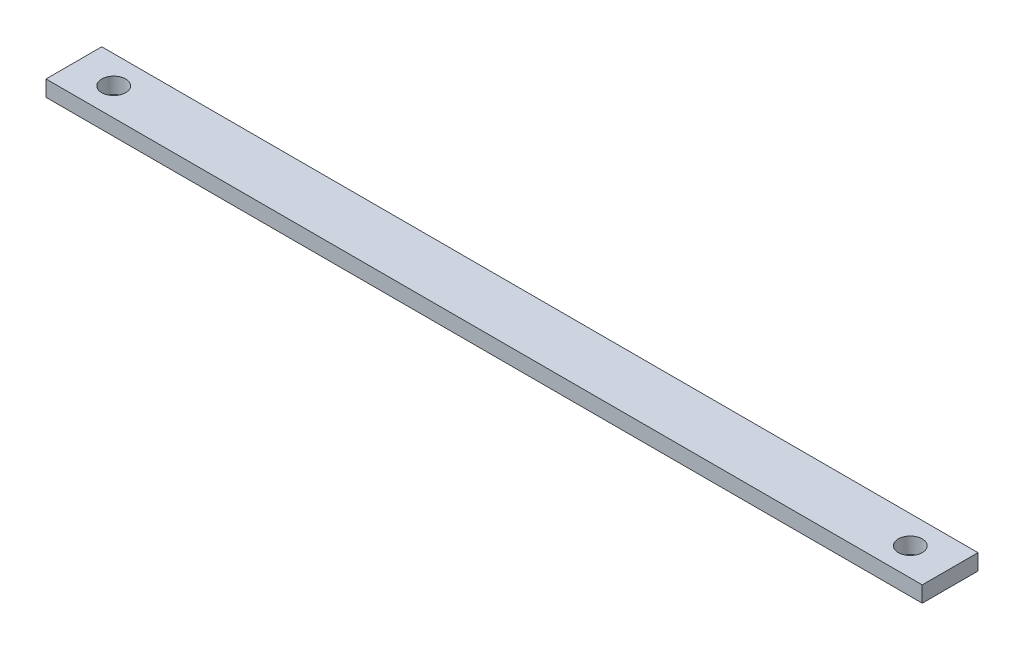
ISO-10303-21;
HEADER;
FILE_DESCRIPTION(('STEP AP214'),'2;1');
FILE_NAME('part.step','',(''),(''),'','','');
FILE_SCHEMA(('AUTOMOTIVE_DESIGN { 1 0 10303 214 1 1 1 1 }'));
ENDSEC;
DATA;
#1=APPLICATION_CONTEXT('core data for automotive mechanical design processes');
#2=APPLICATION_PROTOCOL_DEFINITION('international standard','automotive_design',2000,#1);
#3=PRODUCT_CONTEXT('',#1,'mechanical');
#4=PRODUCT('Part','Part','',(#3));
#5=PRODUCT_RELATED_PRODUCT_CATEGORY('part','',(#4));
#6=PRODUCT_DEFINITION_FORMATION('','',#4);
#7=PRODUCT_DEFINITION_CONTEXT('part definition',#1,'design');
#8=PRODUCT_DEFINITION('design','',#6,#7);
#9=PRODUCT_DEFINITION_SHAPE('','',#8);
#10=(LENGTH_UNIT() NAMED_UNIT(*) SI_UNIT(.MILLI.,.METRE.));
#11=(NAMED_UNIT(*) PLANE_ANGLE_UNIT() SI_UNIT($,.RADIAN.));
#12=(NAMED_UNIT(*) SI_UNIT($,.STERADIAN.) SOLID_ANGLE_UNIT());
#13=UNCERTAINTY_MEASURE_WITH_UNIT(LENGTH_MEASURE(1.E-05),#10,'distance_accuracy_value','');
#14=(GEOMETRIC_REPRESENTATION_CONTEXT(3) GLOBAL_UNCERTAINTY_ASSIGNED_CONTEXT((#13)) GLOBAL_UNIT_ASSIGNED_CONTEXT((#10,
#11,#12)) REPRESENTATION_CONTEXT('',''));
#15=CARTESIAN_POINT('',(0.,0.,0.));
#16=DIRECTION('',(0.,0.,1.));
#17=DIRECTION('',(1.,0.,0.));
#18=AXIS2_PLACEMENT_3D('',#15,#16,#17);
#19=CARTESIAN_POINT('',(0.,2.,0.));
#20=DIRECTION('',(0.,-1.,0.));
#21=DIRECTION('',(0.,0.,-1.));
#22=AXIS2_PLACEMENT_3D('',#19,#20,#21);
#23=PLANE('',#22);
#24=DIRECTION('',(0.,0.,-1.));
#25=VECTOR('',#24,1.);
#26=CARTESIAN_POINT('',(55.,2.,3.5));
#27=LINE('',#26,#25);
#28=CARTESIAN_POINT('',(55.,2.,3.5));
#29=VERTEX_POINT('',#28);
#30=CARTESIAN_POINT('',(55.,2.,-3.5));
#31=VERTEX_POINT('',#30);
#32=EDGE_CURVE('E98',#29,#31,#27,.T.);
#33=ORIENTED_EDGE('',*,*,#32,.T.);
#34=DIRECTION('',(-1.,0.,0.));
#35=VECTOR('',#34,1.);
#36=CARTESIAN_POINT('',(-55.,2.,-3.5));
#37=LINE('',#36,#35);
#38=CARTESIAN_POINT('',(-55.,2.,-3.5));
#39=VERTEX_POINT('',#38);
#40=EDGE_CURVE('E93',#31,#39,#37,.T.);
#41=ORIENTED_EDGE('',*,*,#40,.T.);
#42=DIRECTION('',(0.,0.,1.));
#43=VECTOR('',#42,1.);
#44=CARTESIAN_POINT('',(-55.,2.,3.5));
#45=LINE('',#44,#43);
#46=CARTESIAN_POINT('',(-55.,2.,3.5));
#47=VERTEX_POINT('',#46);
#48=EDGE_CURVE('E96',#39,#47,#45,.T.);
#49=ORIENTED_EDGE('',*,*,#48,.T.);
#50=DIRECTION('',(1.,0.,0.));
#51=VECTOR('',#50,1.);
#52=CARTESIAN_POINT('',(-55.,2.,3.5));
#53=LINE('',#52,#51);
#54=EDGE_CURVE('E63',#47,#29,#53,.T.);
#55=ORIENTED_EDGE('',*,*,#54,.T.);
#56=EDGE_LOOP('',(#33,#41,#49,#55));
#57=FACE_BOUND('',#56,.T.);
#58=CARTESIAN_POINT('',(-50.,2.,0.));
#59=DIRECTION('',(0.,1.,0.));
#60=DIRECTION('',(0.,0.,1.));
#61=AXIS2_PLACEMENT_3D('',#58,#59,#60);
#62=CIRCLE('',#61,1.5);
#63=CARTESIAN_POINT('',(-50.,2.,1.5));
#64=VERTEX_POINT('',#63);
#65=EDGE_CURVE('E118',#64,#64,#62,.T.);
#66=ORIENTED_EDGE('',*,*,#65,.F.);
#67=EDGE_LOOP('',(#66));
#68=FACE_BOUND('',#67,.T.);
#69=CARTESIAN_POINT('',(50.,2.,0.));
#70=DIRECTION('',(0.,1.,0.));
#71=DIRECTION('',(0.,0.,-1.));
#72=AXIS2_PLACEMENT_3D('',#69,#70,#71);
#73=CIRCLE('',#72,1.5);
#74=CARTESIAN_POINT('',(50.,2.,-1.5));
#75=VERTEX_POINT('',#74);
#76=EDGE_CURVE('E140',#75,#75,#73,.T.);
#77=ORIENTED_EDGE('',*,*,#76,.F.);
#78=EDGE_LOOP('',(#77));
#79=FACE_BOUND('',#78,.T.);
#80=ADVANCED_FACE('F45',(#57,#68,#79),#23,.F.);
#81=CARTESIAN_POINT('',(0.,0.,0.));
#82=DIRECTION('',(0.,-1.,0.));
#83=DIRECTION('',(0.,0.,-1.));
#84=AXIS2_PLACEMENT_3D('',#81,#82,#83);
#85=PLANE('',#84);
#86=CARTESIAN_POINT('',(-50.,0.,0.));
#87=DIRECTION('',(0.,1.,0.));
#88=DIRECTION('',(0.,0.,1.));
#89=AXIS2_PLACEMENT_3D('',#86,#87,#88);
#90=CIRCLE('',#89,1.5);
#91=CARTESIAN_POINT('',(-50.,0.,1.5));
#92=VERTEX_POINT('',#91);
#93=EDGE_CURVE('E136',#92,#92,#90,.T.);
#94=ORIENTED_EDGE('',*,*,#93,.T.);
#95=EDGE_LOOP('',(#94));
#96=FACE_BOUND('',#95,.T.);
#97=DIRECTION('',(0.,0.,-1.));
#98=VECTOR('',#97,1.);
#99=CARTESIAN_POINT('',(55.,0.,3.5));
#100=LINE('',#99,#98);
#101=CARTESIAN_POINT('',(55.,0.,3.5));
#102=VERTEX_POINT('',#101);
#103=CARTESIAN_POINT('',(55.,0.,-3.5));
#104=VERTEX_POINT('',#103);
#105=EDGE_CURVE('E114',#102,#104,#100,.T.);
#106=ORIENTED_EDGE('',*,*,#105,.F.);
#107=DIRECTION('',(1.,0.,0.));
#108=VECTOR('',#107,1.);
#109=CARTESIAN_POINT('',(-55.,0.,3.5));
#110=LINE('',#109,#108);
#111=CARTESIAN_POINT('',(-55.,0.,3.5));
#112=VERTEX_POINT('',#111);
#113=EDGE_CURVE('E86',#112,#102,#110,.T.);
#114=ORIENTED_EDGE('',*,*,#113,.F.);
#115=DIRECTION('',(0.,0.,1.));
#116=VECTOR('',#115,1.);
#117=CARTESIAN_POINT('',(-55.,0.,3.5));
#118=LINE('',#117,#116);
#119=CARTESIAN_POINT('',(-55.,0.,-3.5));
#120=VERTEX_POINT('',#119);
#121=EDGE_CURVE('E80',#120,#112,#118,.T.);
#122=ORIENTED_EDGE('',*,*,#121,.F.);
#123=DIRECTION('',(-1.,0.,0.));
#124=VECTOR('',#123,1.);
#125=CARTESIAN_POINT('',(-55.,0.,-3.5));
#126=LINE('',#125,#124);
#127=EDGE_CURVE('E103',#104,#120,#126,.T.);
#128=ORIENTED_EDGE('',*,*,#127,.F.);
#129=EDGE_LOOP('',(#106,#114,#122,#128));
#130=FACE_BOUND('',#129,.T.);
#131=CARTESIAN_POINT('',(50.,0.,0.));
#132=DIRECTION('',(0.,1.,0.));
#133=DIRECTION('',(0.,0.,-1.));
#134=AXIS2_PLACEMENT_3D('',#131,#132,#133);
#135=CIRCLE('',#134,1.5);
#136=CARTESIAN_POINT('',(50.,0.,-1.5));
#137=VERTEX_POINT('',#136);
#138=EDGE_CURVE('E144',#137,#137,#135,.T.);
#139=ORIENTED_EDGE('',*,*,#138,.T.);
#140=EDGE_LOOP('',(#139));
#141=FACE_BOUND('',#140,.T.);
#142=ADVANCED_FACE('F131',(#96,#130,#141),#85,.T.);
#143=CARTESIAN_POINT('',(55.,2.,3.5));
#144=DIRECTION('',(-1.,0.,0.));
#145=DIRECTION('',(0.,0.,1.));
#146=AXIS2_PLACEMENT_3D('',#143,#144,#145);
#147=PLANE('',#146);
#148=ORIENTED_EDGE('',*,*,#105,.T.);
#149=DIRECTION('',(0.,-1.,0.));
#150=VECTOR('',#149,1.);
#151=CARTESIAN_POINT('',(55.,2.,-3.5));
#152=LINE('',#151,#150);
#153=EDGE_CURVE('E11',#31,#104,#152,.T.);
#154=ORIENTED_EDGE('',*,*,#153,.F.);
#155=ORIENTED_EDGE('',*,*,#32,.F.);
#156=DIRECTION('',(0.,-1.,0.));
#157=VECTOR('',#156,1.);
#158=CARTESIAN_POINT('',(55.,2.,3.5));
#159=LINE('',#158,#157);
#160=EDGE_CURVE('E110',#29,#102,#159,.T.);
#161=ORIENTED_EDGE('',*,*,#160,.T.);
#162=EDGE_LOOP('',(#148,#154,#155,#161));
#163=FACE_BOUND('',#162,.T.);
#164=ADVANCED_FACE('F47',(#163),#147,.F.);
#165=CARTESIAN_POINT('',(-55.,2.,-3.5));
#166=DIRECTION('',(0.,0.,1.));
#167=DIRECTION('',(1.,0.,0.));
#168=AXIS2_PLACEMENT_3D('',#165,#166,#167);
#169=PLANE('',#168);
#170=ORIENTED_EDGE('',*,*,#127,.T.);
#171=DIRECTION('',(0.,-1.,0.));
#172=VECTOR('',#171,1.);
#173=CARTESIAN_POINT('',(-55.,2.,-3.5));
#174=LINE('',#173,#172);
#175=EDGE_CURVE('E55',#39,#120,#174,.T.);
#176=ORIENTED_EDGE('',*,*,#175,.F.);
#177=ORIENTED_EDGE('',*,*,#40,.F.);
#178=ORIENTED_EDGE('',*,*,#153,.T.);
#179=EDGE_LOOP('',(#170,#176,#177,#178));
#180=FACE_BOUND('',#179,.T.);
#181=ADVANCED_FACE('F102',(#180),#169,.F.);
#182=CARTESIAN_POINT('',(-55.,2.,3.5));
#183=DIRECTION('',(1.,0.,0.));
#184=DIRECTION('',(0.,0.,-1.));
#185=AXIS2_PLACEMENT_3D('',#182,#183,#184);
#186=PLANE('',#185);
#187=ORIENTED_EDGE('',*,*,#121,.T.);
#188=DIRECTION('',(0.,-1.,0.));
#189=VECTOR('',#188,1.);
#190=CARTESIAN_POINT('',(-55.,2.,3.5));
#191=LINE('',#190,#189);
#192=EDGE_CURVE('E105',#47,#112,#191,.T.);
#193=ORIENTED_EDGE('',*,*,#192,.F.);
#194=ORIENTED_EDGE('',*,*,#48,.F.);
#195=ORIENTED_EDGE('',*,*,#175,.T.);
#196=EDGE_LOOP('',(#187,#193,#194,#195));
#197=FACE_BOUND('',#196,.T.);
#198=ADVANCED_FACE('F106',(#197),#186,.F.);
#199=CARTESIAN_POINT('',(-55.,2.,3.5));
#200=DIRECTION('',(0.,0.,-1.));
#201=DIRECTION('',(-1.,0.,0.));
#202=AXIS2_PLACEMENT_3D('',#199,#200,#201);
#203=PLANE('',#202);
#204=ORIENTED_EDGE('',*,*,#113,.T.);
#205=ORIENTED_EDGE('',*,*,#160,.F.);
#206=ORIENTED_EDGE('',*,*,#54,.F.);
#207=ORIENTED_EDGE('',*,*,#192,.T.);
#208=EDGE_LOOP('',(#204,#205,#206,#207));
#209=FACE_BOUND('',#208,.T.);
#210=ADVANCED_FACE('F128',(#209),#203,.F.);
#211=CARTESIAN_POINT('',(-50.,2.,0.));
#212=DIRECTION('',(0.,-1.,0.));
#213=DIRECTION('',(0.,0.,-1.));
#214=AXIS2_PLACEMENT_3D('',#211,#212,#213);
#215=CYLINDRICAL_SURFACE('',#214,1.5);
#216=ORIENTED_EDGE('',*,*,#65,.T.);
#217=EDGE_LOOP('',(#216));
#218=FACE_BOUND('',#217,.T.);
#219=ORIENTED_EDGE('',*,*,#93,.F.);
#220=EDGE_LOOP('',(#219));
#221=FACE_BOUND('',#220,.T.);
#222=ADVANCED_FACE('F163',(#218,#221),#215,.F.);
#223=CARTESIAN_POINT('',(50.,2.,0.));
#224=DIRECTION('',(0.,-1.,0.));
#225=DIRECTION('',(0.,0.,-1.));
#226=AXIS2_PLACEMENT_3D('',#223,#224,#225);
#227=CYLINDRICAL_SURFACE('',#226,1.5);
#228=ORIENTED_EDGE('',*,*,#76,.T.);
#229=EDGE_LOOP('',(#228));
#230=FACE_BOUND('',#229,.T.);
#231=ORIENTED_EDGE('',*,*,#138,.F.);
#232=EDGE_LOOP('',(#231));
#233=FACE_BOUND('',#232,.T.);
#234=ADVANCED_FACE('F152',(#230,#233),#227,.F.);
#235=CLOSED_SHELL('',(#80,#142,#164,#181,#198,#210,#222,#234));
#236=MANIFOLD_SOLID_BREP('B2',#235);
#237=ADVANCED_BREP_SHAPE_REPRESENTATION('',(#18,#236),#14);
#238=SHAPE_DEFINITION_REPRESENTATION(#9,#237);
ENDSEC;
END-ISO-10303-21;
